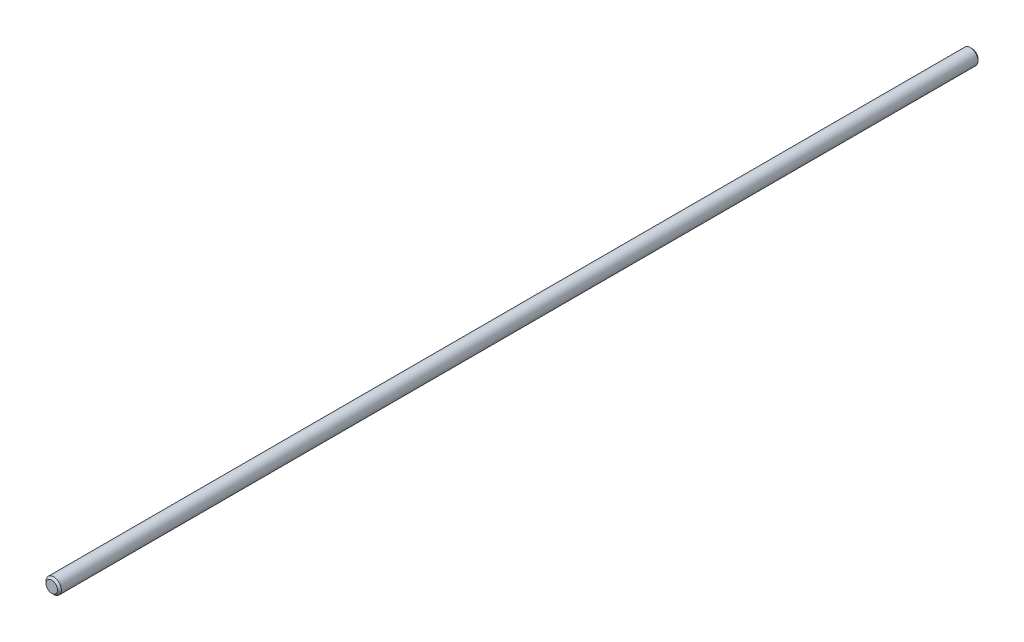
ISO-10303-21;
HEADER;
FILE_DESCRIPTION(('STEP AP214'),'2;1');
FILE_NAME('part.step','',(''),(''),'','','');
FILE_SCHEMA(('AUTOMOTIVE_DESIGN { 1 0 10303 214 1 1 1 1 }'));
ENDSEC;
DATA;
#1=APPLICATION_CONTEXT('core data for automotive mechanical design processes');
#2=APPLICATION_PROTOCOL_DEFINITION('international standard','automotive_design',2000,#1);
#3=PRODUCT_CONTEXT('',#1,'mechanical');
#4=PRODUCT('Part','Part','',(#3));
#5=PRODUCT_RELATED_PRODUCT_CATEGORY('part','',(#4));
#6=PRODUCT_DEFINITION_FORMATION('','',#4);
#7=PRODUCT_DEFINITION_CONTEXT('part definition',#1,'design');
#8=PRODUCT_DEFINITION('design','',#6,#7);
#9=PRODUCT_DEFINITION_SHAPE('','',#8);
#10=(LENGTH_UNIT() NAMED_UNIT(*) SI_UNIT(.MILLI.,.METRE.));
#11=(NAMED_UNIT(*) PLANE_ANGLE_UNIT() SI_UNIT($,.RADIAN.));
#12=(NAMED_UNIT(*) SI_UNIT($,.STERADIAN.) SOLID_ANGLE_UNIT());
#13=UNCERTAINTY_MEASURE_WITH_UNIT(LENGTH_MEASURE(1.E-05),#10,'distance_accuracy_value','');
#14=(GEOMETRIC_REPRESENTATION_CONTEXT(3) GLOBAL_UNCERTAINTY_ASSIGNED_CONTEXT((#13)) GLOBAL_UNIT_ASSIGNED_CONTEXT((#10,
#11,#12)) REPRESENTATION_CONTEXT('',''));
#15=CARTESIAN_POINT('',(0.,0.,0.));
#16=DIRECTION('',(0.,0.,1.));
#17=DIRECTION('',(1.,0.,0.));
#18=AXIS2_PLACEMENT_3D('',#15,#16,#17);
#19=CARTESIAN_POINT('',(0.,0.,240.));
#20=DIRECTION('',(0.,0.,1.));
#21=DIRECTION('',(1.,0.,0.));
#22=AXIS2_PLACEMENT_3D('',#19,#20,#21);
#23=PLANE('',#22);
#24=CARTESIAN_POINT('',(0.,0.,240.000000000009));
#25=DIRECTION('',(0.,0.,-1.));
#26=DIRECTION('',(-1.,0.,0.));
#27=AXIS2_PLACEMENT_3D('',#24,#25,#26);
#28=CIRCLE('',#27,1.50000000002137);
#29=CARTESIAN_POINT('',(-1.50000000002137,0.,240.000000000009));
#30=VERTEX_POINT('',#29);
#31=EDGE_CURVE('E18',#30,#30,#28,.T.);
#32=ORIENTED_EDGE('',*,*,#31,.F.);
#33=EDGE_LOOP('',(#32));
#34=FACE_BOUND('',#33,.T.);
#35=ADVANCED_FACE('F15',(#34),#23,.T.);
#36=CARTESIAN_POINT('',(0.,0.,0.));
#37=DIRECTION('',(0.,0.,1.));
#38=DIRECTION('',(1.,0.,0.));
#39=AXIS2_PLACEMENT_3D('',#36,#37,#38);
#40=PLANE('',#39);
#41=CARTESIAN_POINT('',(0.,0.,5.68433104405908E-11));
#42=DIRECTION('',(0.,0.,1.));
#43=DIRECTION('',(1.,0.,0.));
#44=AXIS2_PLACEMENT_3D('',#41,#42,#43);
#45=CIRCLE('',#44,1.50000000002137);
#46=CARTESIAN_POINT('',(1.50000000002137,0.,5.68433104405908E-11));
#47=VERTEX_POINT('',#46);
#48=EDGE_CURVE('E27',#47,#47,#45,.T.);
#49=ORIENTED_EDGE('',*,*,#48,.F.);
#50=EDGE_LOOP('',(#49));
#51=FACE_BOUND('',#50,.T.);
#52=ADVANCED_FACE('F38',(#51),#40,.F.);
#53=CARTESIAN_POINT('',(0.,0.,239.500000000021));
#54=DIRECTION('',(0.,0.,-1.));
#55=DIRECTION('',(-1.,0.,0.));
#56=AXIS2_PLACEMENT_3D('',#53,#54,#55);
#57=CONICAL_SURFACE('',#56,2.00000000000955,0.785398163397448);
#58=CARTESIAN_POINT('',(0.,0.,239.5));
#59=DIRECTION('',(0.,0.,-1.));
#60=DIRECTION('',(-1.,0.,0.));
#61=AXIS2_PLACEMENT_3D('',#58,#59,#60);
#62=CIRCLE('',#61,2.);
#63=CARTESIAN_POINT('',(-2.,0.,239.5));
#64=VERTEX_POINT('',#63);
#65=EDGE_CURVE('E22',#64,#64,#62,.T.);
#66=ORIENTED_EDGE('',*,*,#65,.F.);
#67=EDGE_LOOP('',(#66));
#68=FACE_BOUND('',#67,.T.);
#69=ORIENTED_EDGE('',*,*,#31,.T.);
#70=EDGE_LOOP('',(#69));
#71=FACE_BOUND('',#70,.T.);
#72=ADVANCED_FACE('F35',(#68,#71),#57,.T.);
#73=CARTESIAN_POINT('',(0.,0.,0.49999999987449));
#74=DIRECTION('',(0.,0.,1.));
#75=DIRECTION('',(1.,0.,0.));
#76=AXIS2_PLACEMENT_3D('',#73,#74,#75);
#77=CONICAL_SURFACE('',#76,1.99999999989586,0.785398163454292);
#78=CARTESIAN_POINT('',(0.,0.,0.500000000000028));
#79=DIRECTION('',(0.,0.,-1.));
#80=DIRECTION('',(-1.,0.,0.));
#81=AXIS2_PLACEMENT_3D('',#78,#79,#80);
#82=CIRCLE('',#81,2.);
#83=CARTESIAN_POINT('',(-2.,0.,0.500000000000028));
#84=VERTEX_POINT('',#83);
#85=EDGE_CURVE('E9',#84,#84,#82,.F.);
#86=ORIENTED_EDGE('',*,*,#85,.F.);
#87=EDGE_LOOP('',(#86));
#88=FACE_BOUND('',#87,.T.);
#89=ORIENTED_EDGE('',*,*,#48,.T.);
#90=EDGE_LOOP('',(#89));
#91=FACE_BOUND('',#90,.T.);
#92=ADVANCED_FACE('F45',(#88,#91),#77,.T.);
#93=CARTESIAN_POINT('',(0.,0.,240.));
#94=DIRECTION('',(0.,0.,-1.));
#95=DIRECTION('',(-1.,0.,0.));
#96=AXIS2_PLACEMENT_3D('',#93,#94,#95);
#97=CYLINDRICAL_SURFACE('',#96,2.);
#98=ORIENTED_EDGE('',*,*,#85,.T.);
#99=EDGE_LOOP('',(#98));
#100=FACE_BOUND('',#99,.T.);
#101=ORIENTED_EDGE('',*,*,#65,.T.);
#102=EDGE_LOOP('',(#101));
#103=FACE_BOUND('',#102,.T.);
#104=ADVANCED_FACE('F43',(#100,#103),#97,.T.);
#105=CLOSED_SHELL('',(#35,#52,#72,#92,#104));
#106=MANIFOLD_SOLID_BREP('B1',#105);
#107=ADVANCED_BREP_SHAPE_REPRESENTATION('',(#18,#106),#14);
#108=SHAPE_DEFINITION_REPRESENTATION(#9,#107);
ENDSEC;
END-ISO-10303-21;
